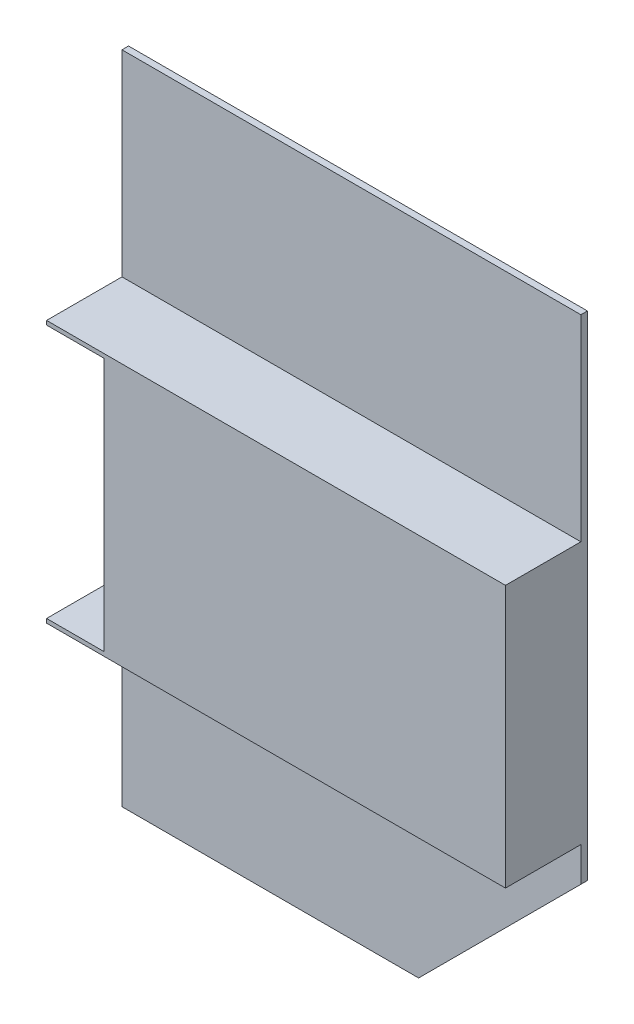
ISO-10303-21;
HEADER;
FILE_DESCRIPTION(('STEP AP214'),'2;1');
FILE_NAME('part.step','',(''),(''),'','','');
FILE_SCHEMA(('AUTOMOTIVE_DESIGN { 1 0 10303 214 1 1 1 1 }'));
ENDSEC;
DATA;
#1=APPLICATION_CONTEXT('core data for automotive mechanical design processes');
#2=APPLICATION_PROTOCOL_DEFINITION('international standard','automotive_design',2000,#1);
#3=PRODUCT_CONTEXT('',#1,'mechanical');
#4=PRODUCT('Part','Part','',(#3));
#5=PRODUCT_RELATED_PRODUCT_CATEGORY('part','',(#4));
#6=PRODUCT_DEFINITION_FORMATION('','',#4);
#7=PRODUCT_DEFINITION_CONTEXT('part definition',#1,'design');
#8=PRODUCT_DEFINITION('design','',#6,#7);
#9=PRODUCT_DEFINITION_SHAPE('','',#8);
#10=(LENGTH_UNIT() NAMED_UNIT(*) SI_UNIT(.MILLI.,.METRE.));
#11=(NAMED_UNIT(*) PLANE_ANGLE_UNIT() SI_UNIT($,.RADIAN.));
#12=(NAMED_UNIT(*) SI_UNIT($,.STERADIAN.) SOLID_ANGLE_UNIT());
#13=UNCERTAINTY_MEASURE_WITH_UNIT(LENGTH_MEASURE(1.E-05),#10,'distance_accuracy_value','');
#14=(GEOMETRIC_REPRESENTATION_CONTEXT(3) GLOBAL_UNCERTAINTY_ASSIGNED_CONTEXT((#13)) GLOBAL_UNIT_ASSIGNED_CONTEXT((#10,
#11,#12)) REPRESENTATION_CONTEXT('',''));
#15=CARTESIAN_POINT('',(0.,0.,0.));
#16=DIRECTION('',(0.,0.,1.));
#17=DIRECTION('',(1.,0.,0.));
#18=AXIS2_PLACEMENT_3D('',#15,#16,#17);
#19=CARTESIAN_POINT('',(2.65,0.4,0.25));
#20=DIRECTION('',(0.,1.,0.));
#21=DIRECTION('',(0.,0.,1.));
#22=AXIS2_PLACEMENT_3D('',#19,#20,#21);
#23=PLANE('',#22);
#24=DIRECTION('',(1.,0.,0.));
#25=VECTOR('',#24,1.);
#26=CARTESIAN_POINT('',(0.,0.4,0.0199999958276701));
#27=LINE('',#26,#25);
#28=CARTESIAN_POINT('',(-1.2,0.4,0.01999998489017));
#29=VERTEX_POINT('',#28);
#30=CARTESIAN_POINT('',(-2.6,0.4,0.01999998957767));
#31=VERTEX_POINT('',#30);
#32=EDGE_CURVE('E125',#29,#31,#27,.F.);
#33=ORIENTED_EDGE('',*,*,#32,.T.);
#34=DIRECTION('',(0.,0.,1.));
#35=VECTOR('',#34,1.);
#36=CARTESIAN_POINT('',(-2.6,0.4,0.25));
#37=LINE('',#36,#35);
#38=CARTESIAN_POINT('',(-2.6,0.3999999984375,0.25));
#39=VERTEX_POINT('',#38);
#40=EDGE_CURVE('E134',#31,#39,#37,.T.);
#41=ORIENTED_EDGE('',*,*,#40,.T.);
#42=DIRECTION('',(1.,0.,0.));
#43=VECTOR('',#42,1.);
#44=CARTESIAN_POINT('',(-1.2,0.39999999375,0.25));
#45=LINE('',#44,#43);
#46=CARTESIAN_POINT('',(-1.2,0.3999999984375,0.25));
#47=VERTEX_POINT('',#46);
#48=EDGE_CURVE('E132',#39,#47,#45,.T.);
#49=ORIENTED_EDGE('',*,*,#48,.T.);
#50=DIRECTION('',(0.,0.,1.));
#51=VECTOR('',#50,1.);
#52=CARTESIAN_POINT('',(-1.2,0.4,0.25));
#53=LINE('',#52,#51);
#54=EDGE_CURVE('E20',#47,#29,#53,.F.);
#55=ORIENTED_EDGE('',*,*,#54,.T.);
#56=EDGE_LOOP('',(#33,#41,#49,#55));
#57=FACE_BOUND('',#56,.T.);
#58=ADVANCED_FACE('F17',(#57),#23,.T.);
#59=CARTESIAN_POINT('',(2.65,-0.4,0.25));
#60=DIRECTION('',(0.,1.,0.));
#61=DIRECTION('',(0.,0.,1.));
#62=AXIS2_PLACEMENT_3D('',#59,#60,#61);
#63=PLANE('',#62);
#64=DIRECTION('',(0.,0.,1.));
#65=VECTOR('',#64,1.);
#66=CARTESIAN_POINT('',(-2.6,-0.4,0.25));
#67=LINE('',#66,#65);
#68=CARTESIAN_POINT('',(-2.6,-0.4,0.01999999582768));
#69=VERTEX_POINT('',#68);
#70=CARTESIAN_POINT('',(-2.6,-0.4,0.25));
#71=VERTEX_POINT('',#70);
#72=EDGE_CURVE('E126',#69,#71,#67,.T.);
#73=ORIENTED_EDGE('',*,*,#72,.F.);
#74=DIRECTION('',(1.,0.,0.));
#75=VECTOR('',#74,1.);
#76=CARTESIAN_POINT('',(-2.65,-0.4,0.0199999958276798));
#77=LINE('',#76,#75);
#78=CARTESIAN_POINT('',(-1.2,-0.4,0.01999999582768));
#79=VERTEX_POINT('',#78);
#80=EDGE_CURVE('E138',#69,#79,#77,.T.);
#81=ORIENTED_EDGE('',*,*,#80,.T.);
#82=DIRECTION('',(0.,0.,1.));
#83=VECTOR('',#82,1.);
#84=CARTESIAN_POINT('',(-1.2,-0.4,0.25));
#85=LINE('',#84,#83);
#86=CARTESIAN_POINT('',(-1.2,-0.4,0.25));
#87=VERTEX_POINT('',#86);
#88=EDGE_CURVE('E143',#87,#79,#85,.F.);
#89=ORIENTED_EDGE('',*,*,#88,.F.);
#90=DIRECTION('',(1.,0.,0.));
#91=VECTOR('',#90,1.);
#92=CARTESIAN_POINT('',(-1.2,-0.4,0.25));
#93=LINE('',#92,#91);
#94=EDGE_CURVE('E153',#87,#71,#93,.F.);
#95=ORIENTED_EDGE('',*,*,#94,.T.);
#96=EDGE_LOOP('',(#73,#81,#89,#95));
#97=FACE_BOUND('',#96,.T.);
#98=ADVANCED_FACE('F172',(#97),#63,.F.);
#99=CARTESIAN_POINT('',(0.,0.7,0.01999999582767));
#100=DIRECTION('',(0.,0.,-1.));
#101=DIRECTION('',(0.,1.,0.));
#102=AXIS2_PLACEMENT_3D('',#99,#100,#101);
#103=PLANE('',#102);
#104=DIRECTION('',(0.,1.,0.));
#105=VECTOR('',#104,1.);
#106=CARTESIAN_POINT('',(-2.6,1.,0.01999998332767));
#107=LINE('',#106,#105);
#108=CARTESIAN_POINT('',(-2.6,1.,0.01999998489017));
#109=VERTEX_POINT('',#108);
#110=EDGE_CURVE('E136',#109,#31,#107,.F.);
#111=ORIENTED_EDGE('',*,*,#110,.T.);
#112=ORIENTED_EDGE('',*,*,#32,.F.);
#113=DIRECTION('',(0.,1.,0.));
#114=VECTOR('',#113,1.);
#115=CARTESIAN_POINT('',(-1.2,0.7,0.01999999582767));
#116=LINE('',#115,#114);
#117=CARTESIAN_POINT('',(-1.2,1.,0.01999998645267));
#118=VERTEX_POINT('',#117);
#119=EDGE_CURVE('E114',#118,#29,#116,.F.);
#120=ORIENTED_EDGE('',*,*,#119,.F.);
#121=DIRECTION('',(1.,0.,0.));
#122=VECTOR('',#121,1.);
#123=CARTESIAN_POINT('',(-1.2,1.,0.01999997707767));
#124=LINE('',#123,#122);
#125=EDGE_CURVE('E160',#118,#109,#124,.F.);
#126=ORIENTED_EDGE('',*,*,#125,.T.);
#127=EDGE_LOOP('',(#111,#112,#120,#126));
#128=FACE_BOUND('',#127,.T.);
#129=ADVANCED_FACE('F135',(#128),#103,.F.);
#130=CARTESIAN_POINT('',(-2.65,-1.,0.01999999582768));
#131=DIRECTION('',(0.,0.,-1.));
#132=DIRECTION('',(0.,1.,0.));
#133=AXIS2_PLACEMENT_3D('',#130,#131,#132);
#134=PLANE('',#133);
#135=ORIENTED_EDGE('',*,*,#80,.F.);
#136=DIRECTION('',(0.,1.,0.));
#137=VECTOR('',#136,1.);
#138=CARTESIAN_POINT('',(-2.6,-1.,0.01999999582768));
#139=LINE('',#138,#137);
#140=CARTESIAN_POINT('',(-2.6,-1.,0.01999999739018));
#141=VERTEX_POINT('',#140);
#142=EDGE_CURVE('E109',#141,#69,#139,.T.);
#143=ORIENTED_EDGE('',*,*,#142,.F.);
#144=DIRECTION('',(1.,0.,0.));
#145=VECTOR('',#144,1.);
#146=CARTESIAN_POINT('',(-2.6,-1.,0.02000000207768));
#147=LINE('',#146,#145);
#148=CARTESIAN_POINT('',(-1.69497498946323,-0.999999999999775,0.01999999739018));
#149=VERTEX_POINT('',#148);
#150=EDGE_CURVE('E234',#141,#149,#147,.T.);
#151=ORIENTED_EDGE('',*,*,#150,.T.);
#152=DIRECTION('',(0.707107127804963,0.707106434567963,0.));
#153=VECTOR('',#152,1.);
#154=CARTESIAN_POINT('',(-1.2,-0.505025495802,0.01999999582768));
#155=LINE('',#154,#153);
#156=CARTESIAN_POINT('',(-1.2,-0.505025495802,0.01999999582768));
#157=VERTEX_POINT('',#156);
#158=EDGE_CURVE('E178',#157,#149,#155,.F.);
#159=ORIENTED_EDGE('',*,*,#158,.F.);
#160=DIRECTION('',(0.,1.,0.));
#161=VECTOR('',#160,1.);
#162=CARTESIAN_POINT('',(-1.2,1.,0.01999999582768));
#163=LINE('',#162,#161);
#164=EDGE_CURVE('E175',#79,#157,#163,.F.);
#165=ORIENTED_EDGE('',*,*,#164,.F.);
#166=EDGE_LOOP('',(#135,#143,#151,#159,#165));
#167=FACE_BOUND('',#166,.T.);
#168=ADVANCED_FACE('F176',(#167),#134,.F.);
#169=CARTESIAN_POINT('',(-1.2,1.,0.25));
#170=DIRECTION('',(0.,0.,-1.));
#171=DIRECTION('',(0.,1.,0.));
#172=AXIS2_PLACEMENT_3D('',#169,#170,#171);
#173=PLANE('',#172);
#174=DIRECTION('',(0.,1.,0.));
#175=VECTOR('',#174,1.);
#176=CARTESIAN_POINT('',(-2.425,0.3875,0.25));
#177=LINE('',#176,#175);
#178=CARTESIAN_POINT('',(-2.425,0.3875,0.25));
#179=VERTEX_POINT('',#178);
#180=CARTESIAN_POINT('',(-2.425,-0.3875,0.25));
#181=VERTEX_POINT('',#180);
#182=EDGE_CURVE('E223',#179,#181,#177,.F.);
#183=ORIENTED_EDGE('',*,*,#182,.T.);
#184=DIRECTION('',(1.,0.,0.));
#185=VECTOR('',#184,1.);
#186=CARTESIAN_POINT('',(-2.425,-0.3875,0.25));
#187=LINE('',#186,#185);
#188=CARTESIAN_POINT('',(-2.6,-0.3875,0.25));
#189=VERTEX_POINT('',#188);
#190=EDGE_CURVE('E227',#181,#189,#187,.F.);
#191=ORIENTED_EDGE('',*,*,#190,.T.);
#192=DIRECTION('',(0.,1.,0.));
#193=VECTOR('',#192,1.);
#194=CARTESIAN_POINT('',(-2.6,-0.3875,0.25));
#195=LINE('',#194,#193);
#196=EDGE_CURVE('E231',#189,#71,#195,.F.);
#197=ORIENTED_EDGE('',*,*,#196,.T.);
#198=ORIENTED_EDGE('',*,*,#94,.F.);
#199=DIRECTION('',(0.,1.,0.));
#200=VECTOR('',#199,1.);
#201=CARTESIAN_POINT('',(-1.2,1.,0.25));
#202=LINE('',#201,#200);
#203=EDGE_CURVE('E152',#47,#87,#202,.F.);
#204=ORIENTED_EDGE('',*,*,#203,.F.);
#205=ORIENTED_EDGE('',*,*,#48,.F.);
#206=DIRECTION('',(0.,1.,0.));
#207=VECTOR('',#206,1.);
#208=CARTESIAN_POINT('',(-2.6,1.,0.25));
#209=LINE('',#208,#207);
#210=CARTESIAN_POINT('',(-2.6,0.3875,0.25));
#211=VERTEX_POINT('',#210);
#212=EDGE_CURVE('E149',#39,#211,#209,.F.);
#213=ORIENTED_EDGE('',*,*,#212,.T.);
#214=DIRECTION('',(1.,0.,0.));
#215=VECTOR('',#214,1.);
#216=CARTESIAN_POINT('',(-1.2,0.3875,0.25));
#217=LINE('',#216,#215);
#218=EDGE_CURVE('E162',#179,#211,#217,.F.);
#219=ORIENTED_EDGE('',*,*,#218,.F.);
#220=EDGE_LOOP('',(#183,#191,#197,#198,#204,#205,#213,#219));
#221=FACE_BOUND('',#220,.T.);
#222=ADVANCED_FACE('F148',(#221),#173,.F.);
#223=CARTESIAN_POINT('',(-2.6,1.,0.));
#224=DIRECTION('',(1.,0.,0.));
#225=DIRECTION('',(0.,0.,-1.));
#226=AXIS2_PLACEMENT_3D('',#223,#224,#225);
#227=PLANE('',#226);
#228=DIRECTION('',(0.,0.,1.));
#229=VECTOR('',#228,1.);
#230=CARTESIAN_POINT('',(-2.6,0.3875,0.));
#231=LINE('',#230,#229);
#232=CARTESIAN_POINT('',(-2.6,0.3875,0.));
#233=VERTEX_POINT('',#232);
#234=EDGE_CURVE('E157',#233,#211,#231,.T.);
#235=ORIENTED_EDGE('',*,*,#234,.T.);
#236=ORIENTED_EDGE('',*,*,#212,.F.);
#237=ORIENTED_EDGE('',*,*,#40,.F.);
#238=ORIENTED_EDGE('',*,*,#110,.F.);
#239=DIRECTION('',(0.,0.,-1.));
#240=VECTOR('',#239,1.);
#241=CARTESIAN_POINT('',(-2.6,1.,0.));
#242=LINE('',#241,#240);
#243=CARTESIAN_POINT('',(-2.6,1.,0.));
#244=VERTEX_POINT('',#243);
#245=EDGE_CURVE('E158',#109,#244,#242,.T.);
#246=ORIENTED_EDGE('',*,*,#245,.T.);
#247=DIRECTION('',(0.,1.,0.));
#248=VECTOR('',#247,1.);
#249=CARTESIAN_POINT('',(-2.6,1.,0.));
#250=LINE('',#249,#248);
#251=EDGE_CURVE('E192',#233,#244,#250,.T.);
#252=ORIENTED_EDGE('',*,*,#251,.F.);
#253=EDGE_LOOP('',(#235,#236,#237,#238,#246,#252));
#254=FACE_BOUND('',#253,.T.);
#255=ADVANCED_FACE('F155',(#254),#227,.F.);
#256=CARTESIAN_POINT('',(-1.2,1.,0.));
#257=DIRECTION('',(0.,-1.,0.));
#258=DIRECTION('',(0.,0.,-1.));
#259=AXIS2_PLACEMENT_3D('',#256,#257,#258);
#260=PLANE('',#259);
#261=DIRECTION('',(0.,0.,-1.));
#262=VECTOR('',#261,1.);
#263=CARTESIAN_POINT('',(-1.2,1.,0.));
#264=LINE('',#263,#262);
#265=CARTESIAN_POINT('',(-1.2,1.,0.));
#266=VERTEX_POINT('',#265);
#267=EDGE_CURVE('E120',#266,#118,#264,.F.);
#268=ORIENTED_EDGE('',*,*,#267,.F.);
#269=DIRECTION('',(1.,0.,0.));
#270=VECTOR('',#269,1.);
#271=CARTESIAN_POINT('',(-1.2,1.,0.));
#272=LINE('',#271,#270);
#273=EDGE_CURVE('E190',#244,#266,#272,.T.);
#274=ORIENTED_EDGE('',*,*,#273,.F.);
#275=ORIENTED_EDGE('',*,*,#245,.F.);
#276=ORIENTED_EDGE('',*,*,#125,.F.);
#277=EDGE_LOOP('',(#268,#274,#275,#276));
#278=FACE_BOUND('',#277,.T.);
#279=ADVANCED_FACE('F188',(#278),#260,.F.);
#280=CARTESIAN_POINT('',(-1.2,1.,0.));
#281=DIRECTION('',(1.,0.,0.));
#282=DIRECTION('',(0.,0.,-1.));
#283=AXIS2_PLACEMENT_3D('',#280,#281,#282);
#284=PLANE('',#283);
#285=ORIENTED_EDGE('',*,*,#267,.T.);
#286=ORIENTED_EDGE('',*,*,#119,.T.);
#287=ORIENTED_EDGE('',*,*,#54,.F.);
#288=ORIENTED_EDGE('',*,*,#203,.T.);
#289=ORIENTED_EDGE('',*,*,#88,.T.);
#290=ORIENTED_EDGE('',*,*,#164,.T.);
#291=DIRECTION('',(0.,0.,1.));
#292=VECTOR('',#291,1.);
#293=CARTESIAN_POINT('',(-1.2,-0.505025495802,0.));
#294=LINE('',#293,#292);
#295=CARTESIAN_POINT('',(-1.2,-0.505025495802,0.));
#296=VERTEX_POINT('',#295);
#297=EDGE_CURVE('E181',#296,#157,#294,.T.);
#298=ORIENTED_EDGE('',*,*,#297,.F.);
#299=DIRECTION('',(0.,1.,0.));
#300=VECTOR('',#299,1.);
#301=CARTESIAN_POINT('',(-1.2,1.,0.));
#302=LINE('',#301,#300);
#303=EDGE_CURVE('E217',#266,#296,#302,.F.);
#304=ORIENTED_EDGE('',*,*,#303,.F.);
#305=EDGE_LOOP('',(#285,#286,#287,#288,#289,#290,#298,#304));
#306=FACE_BOUND('',#305,.T.);
#307=ADVANCED_FACE('F116',(#306),#284,.T.);
#308=CARTESIAN_POINT('',(-1.2,-0.505025495802,0.));
#309=DIRECTION('',(0.707106434567963,-0.707107127804963,0.));
#310=DIRECTION('',(0.707107127804963,0.707106434567963,0.));
#311=AXIS2_PLACEMENT_3D('',#308,#309,#310);
#312=PLANE('',#311);
#313=ORIENTED_EDGE('',*,*,#158,.T.);
#314=DIRECTION('',(0.,0.,1.));
#315=VECTOR('',#314,1.);
#316=CARTESIAN_POINT('',(-1.694974989463,-1.,0.));
#317=LINE('',#316,#315);
#318=CARTESIAN_POINT('',(-1.69497498946323,-0.999999999999775,0.));
#319=VERTEX_POINT('',#318);
#320=EDGE_CURVE('E236',#149,#319,#317,.F.);
#321=ORIENTED_EDGE('',*,*,#320,.T.);
#322=DIRECTION('',(-0.70710712780432,-0.707106434568605,0.));
#323=VECTOR('',#322,1.);
#324=CARTESIAN_POINT('',(-1.2,-0.505025495802,0.));
#325=LINE('',#324,#323);
#326=EDGE_CURVE('E214',#296,#319,#325,.T.);
#327=ORIENTED_EDGE('',*,*,#326,.F.);
#328=ORIENTED_EDGE('',*,*,#297,.T.);
#329=EDGE_LOOP('',(#313,#321,#327,#328));
#330=FACE_BOUND('',#329,.T.);
#331=ADVANCED_FACE('F240',(#330),#312,.T.);
#332=CARTESIAN_POINT('',(-2.6,-1.,0.));
#333=DIRECTION('',(0.,1.,0.));
#334=DIRECTION('',(0.,0.,1.));
#335=AXIS2_PLACEMENT_3D('',#332,#333,#334);
#336=PLANE('',#335);
#337=DIRECTION('',(0.,0.,-1.));
#338=VECTOR('',#337,1.);
#339=CARTESIAN_POINT('',(-2.6,-1.,0.));
#340=LINE('',#339,#338);
#341=CARTESIAN_POINT('',(-2.6,-1.,0.));
#342=VERTEX_POINT('',#341);
#343=EDGE_CURVE('E229',#141,#342,#340,.T.);
#344=ORIENTED_EDGE('',*,*,#343,.T.);
#345=DIRECTION('',(1.,0.,0.));
#346=VECTOR('',#345,1.);
#347=CARTESIAN_POINT('',(-1.2,-1.,0.));
#348=LINE('',#347,#346);
#349=EDGE_CURVE('E211',#319,#342,#348,.F.);
#350=ORIENTED_EDGE('',*,*,#349,.F.);
#351=ORIENTED_EDGE('',*,*,#320,.F.);
#352=ORIENTED_EDGE('',*,*,#150,.F.);
#353=EDGE_LOOP('',(#344,#350,#351,#352));
#354=FACE_BOUND('',#353,.T.);
#355=ADVANCED_FACE('F245',(#354),#336,.F.);
#356=CARTESIAN_POINT('',(-2.6,-0.3875,0.));
#357=DIRECTION('',(1.,0.,0.));
#358=DIRECTION('',(0.,0.,-1.));
#359=AXIS2_PLACEMENT_3D('',#356,#357,#358);
#360=PLANE('',#359);
#361=DIRECTION('',(0.,1.,0.));
#362=VECTOR('',#361,1.);
#363=CARTESIAN_POINT('',(-2.6,1.,0.));
#364=LINE('',#363,#362);
#365=CARTESIAN_POINT('',(-2.6,-0.3875,0.));
#366=VERTEX_POINT('',#365);
#367=EDGE_CURVE('E207',#342,#366,#364,.T.);
#368=ORIENTED_EDGE('',*,*,#367,.F.);
#369=ORIENTED_EDGE('',*,*,#343,.F.);
#370=ORIENTED_EDGE('',*,*,#142,.T.);
#371=ORIENTED_EDGE('',*,*,#72,.T.);
#372=ORIENTED_EDGE('',*,*,#196,.F.);
#373=DIRECTION('',(0.,0.,-1.));
#374=VECTOR('',#373,1.);
#375=CARTESIAN_POINT('',(-2.6,-0.3875,0.));
#376=LINE('',#375,#374);
#377=EDGE_CURVE('E225',#189,#366,#376,.T.);
#378=ORIENTED_EDGE('',*,*,#377,.T.);
#379=EDGE_LOOP('',(#368,#369,#370,#371,#372,#378));
#380=FACE_BOUND('',#379,.T.);
#381=ADVANCED_FACE('F247',(#380),#360,.F.);
#382=CARTESIAN_POINT('',(-2.425,-0.3875,0.));
#383=DIRECTION('',(0.,-1.,0.));
#384=DIRECTION('',(0.,0.,-1.));
#385=AXIS2_PLACEMENT_3D('',#382,#383,#384);
#386=PLANE('',#385);
#387=ORIENTED_EDGE('',*,*,#190,.F.);
#388=DIRECTION('',(0.,0.,-1.));
#389=VECTOR('',#388,1.);
#390=CARTESIAN_POINT('',(-2.425,-0.3875,0.));
#391=LINE('',#390,#389);
#392=CARTESIAN_POINT('',(-2.425,-0.3875,0.));
#393=VERTEX_POINT('',#392);
#394=EDGE_CURVE('E198',#181,#393,#391,.T.);
#395=ORIENTED_EDGE('',*,*,#394,.T.);
#396=DIRECTION('',(1.,0.,0.));
#397=VECTOR('',#396,1.);
#398=CARTESIAN_POINT('',(-1.2,-0.3875,0.));
#399=LINE('',#398,#397);
#400=EDGE_CURVE('E204',#366,#393,#399,.T.);
#401=ORIENTED_EDGE('',*,*,#400,.F.);
#402=ORIENTED_EDGE('',*,*,#377,.F.);
#403=EDGE_LOOP('',(#387,#395,#401,#402));
#404=FACE_BOUND('',#403,.T.);
#405=ADVANCED_FACE('F252',(#404),#386,.F.);
#406=CARTESIAN_POINT('',(-2.425,0.3875,0.));
#407=DIRECTION('',(1.,0.,0.));
#408=DIRECTION('',(0.,0.,-1.));
#409=AXIS2_PLACEMENT_3D('',#406,#407,#408);
#410=PLANE('',#409);
#411=ORIENTED_EDGE('',*,*,#182,.F.);
#412=DIRECTION('',(0.,0.,1.));
#413=VECTOR('',#412,1.);
#414=CARTESIAN_POINT('',(-2.425,0.3875,0.));
#415=LINE('',#414,#413);
#416=CARTESIAN_POINT('',(-2.425,0.3875,0.));
#417=VERTEX_POINT('',#416);
#418=EDGE_CURVE('E35',#179,#417,#415,.F.);
#419=ORIENTED_EDGE('',*,*,#418,.T.);
#420=DIRECTION('',(0.,1.,0.));
#421=VECTOR('',#420,1.);
#422=CARTESIAN_POINT('',(-2.425,1.,0.));
#423=LINE('',#422,#421);
#424=EDGE_CURVE('E26',#393,#417,#423,.T.);
#425=ORIENTED_EDGE('',*,*,#424,.F.);
#426=ORIENTED_EDGE('',*,*,#394,.F.);
#427=EDGE_LOOP('',(#411,#419,#425,#426));
#428=FACE_BOUND('',#427,.T.);
#429=ADVANCED_FACE('F253',(#428),#410,.F.);
#430=CARTESIAN_POINT('',(-2.6,0.3875,0.));
#431=DIRECTION('',(0.,1.,0.));
#432=DIRECTION('',(0.,0.,1.));
#433=AXIS2_PLACEMENT_3D('',#430,#431,#432);
#434=PLANE('',#433);
#435=ORIENTED_EDGE('',*,*,#218,.T.);
#436=ORIENTED_EDGE('',*,*,#234,.F.);
#437=DIRECTION('',(1.,0.,0.));
#438=VECTOR('',#437,1.);
#439=CARTESIAN_POINT('',(-1.2,0.3875,0.));
#440=LINE('',#439,#438);
#441=EDGE_CURVE('E11',#417,#233,#440,.F.);
#442=ORIENTED_EDGE('',*,*,#441,.F.);
#443=ORIENTED_EDGE('',*,*,#418,.F.);
#444=EDGE_LOOP('',(#435,#436,#442,#443));
#445=FACE_BOUND('',#444,.T.);
#446=ADVANCED_FACE('F196',(#445),#434,.F.);
#447=CARTESIAN_POINT('',(-1.2,1.,0.));
#448=DIRECTION('',(0.,0.,-1.));
#449=DIRECTION('',(0.,1.,0.));
#450=AXIS2_PLACEMENT_3D('',#447,#448,#449);
#451=PLANE('',#450);
#452=ORIENTED_EDGE('',*,*,#424,.T.);
#453=ORIENTED_EDGE('',*,*,#441,.T.);
#454=ORIENTED_EDGE('',*,*,#251,.T.);
#455=ORIENTED_EDGE('',*,*,#273,.T.);
#456=ORIENTED_EDGE('',*,*,#303,.T.);
#457=ORIENTED_EDGE('',*,*,#326,.T.);
#458=ORIENTED_EDGE('',*,*,#349,.T.);
#459=ORIENTED_EDGE('',*,*,#367,.T.);
#460=ORIENTED_EDGE('',*,*,#400,.T.);
#461=EDGE_LOOP('',(#452,#453,#454,#455,#456,#457,#458,#459,#460));
#462=FACE_BOUND('',#461,.T.);
#463=ADVANCED_FACE('F200',(#462),#451,.T.);
#464=CLOSED_SHELL('',(#58,#98,#129,#168,#222,#255,#279,#307,#331,#355,#381,#405,#429,#446,#463));
#465=MANIFOLD_SOLID_BREP('B1',#464);
#466=ADVANCED_BREP_SHAPE_REPRESENTATION('',(#18,#465),#14);
#467=SHAPE_DEFINITION_REPRESENTATION(#9,#466);
ENDSEC;
END-ISO-10303-21;
